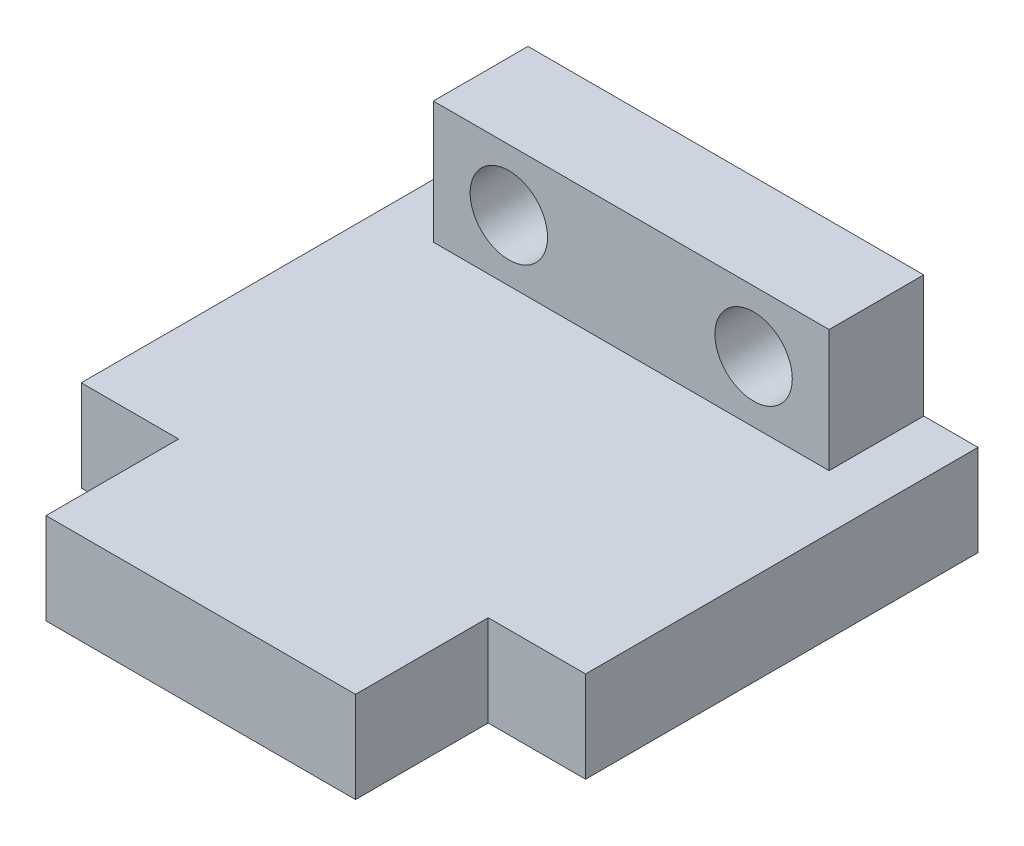
ISO-10303-21;
HEADER;
FILE_DESCRIPTION(('STEP AP214'),'2;1');
FILE_NAME('part.step','',(''),(''),'','','');
FILE_SCHEMA(('AUTOMOTIVE_DESIGN { 1 0 10303 214 1 1 1 1 }'));
ENDSEC;
DATA;
#1=APPLICATION_CONTEXT('core data for automotive mechanical design processes');
#2=APPLICATION_PROTOCOL_DEFINITION('international standard','automotive_design',2000,#1);
#3=PRODUCT_CONTEXT('',#1,'mechanical');
#4=PRODUCT('Part','Part','',(#3));
#5=PRODUCT_RELATED_PRODUCT_CATEGORY('part','',(#4));
#6=PRODUCT_DEFINITION_FORMATION('','',#4);
#7=PRODUCT_DEFINITION_CONTEXT('part definition',#1,'design');
#8=PRODUCT_DEFINITION('design','',#6,#7);
#9=PRODUCT_DEFINITION_SHAPE('','',#8);
#10=(LENGTH_UNIT() NAMED_UNIT(*) SI_UNIT(.MILLI.,.METRE.));
#11=(NAMED_UNIT(*) PLANE_ANGLE_UNIT() SI_UNIT($,.RADIAN.));
#12=(NAMED_UNIT(*) SI_UNIT($,.STERADIAN.) SOLID_ANGLE_UNIT());
#13=UNCERTAINTY_MEASURE_WITH_UNIT(LENGTH_MEASURE(1.E-05),#10,'distance_accuracy_value','');
#14=(GEOMETRIC_REPRESENTATION_CONTEXT(3) GLOBAL_UNCERTAINTY_ASSIGNED_CONTEXT((#13)) GLOBAL_UNIT_ASSIGNED_CONTEXT((#10,
#11,#12)) REPRESENTATION_CONTEXT('',''));
#15=CARTESIAN_POINT('',(0.,0.,0.));
#16=DIRECTION('',(0.,0.,1.));
#17=DIRECTION('',(1.,0.,0.));
#18=AXIS2_PLACEMENT_3D('',#15,#16,#17);
#19=CARTESIAN_POINT('',(0.,6.59,-4.595));
#20=DIRECTION('',(0.,0.,-1.));
#21=DIRECTION('',(-1.,0.,0.));
#22=AXIS2_PLACEMENT_3D('',#19,#20,#21);
#23=PLANE('',#22);
#24=CARTESIAN_POINT('',(-5.535,3.825,-4.595));
#25=DIRECTION('',(0.,0.,1.));
#26=DIRECTION('',(1.,0.,0.));
#27=AXIS2_PLACEMENT_3D('',#24,#25,#26);
#28=CIRCLE('',#27,1.75);
#29=CARTESIAN_POINT('',(-3.785,3.825,-4.595));
#30=VERTEX_POINT('',#29);
#31=EDGE_CURVE('E412',#30,#30,#28,.F.);
#32=ORIENTED_EDGE('',*,*,#31,.T.);
#33=EDGE_LOOP('',(#32));
#34=FACE_BOUND('',#33,.T.);
#35=CARTESIAN_POINT('',(5.535,3.825,-4.595));
#36=DIRECTION('',(0.,0.,1.));
#37=DIRECTION('',(1.,0.,0.));
#38=AXIS2_PLACEMENT_3D('',#35,#36,#37);
#39=CIRCLE('',#38,1.75);
#40=CARTESIAN_POINT('',(7.285,3.825,-4.595));
#41=VERTEX_POINT('',#40);
#42=EDGE_CURVE('E411',#41,#41,#39,.T.);
#43=ORIENTED_EDGE('',*,*,#42,.F.);
#44=EDGE_LOOP('',(#43));
#45=FACE_BOUND('',#44,.T.);
#46=DIRECTION('',(1.,0.,0.));
#47=VECTOR('',#46,1.);
#48=CARTESIAN_POINT('',(0.,6.59,-4.595));
#49=LINE('',#48,#47);
#50=CARTESIAN_POINT('',(-8.95,6.59,-4.595));
#51=VERTEX_POINT('',#50);
#52=CARTESIAN_POINT('',(8.95,6.59,-4.595));
#53=VERTEX_POINT('',#52);
#54=EDGE_CURVE('E427',#51,#53,#49,.T.);
#55=ORIENTED_EDGE('',*,*,#54,.F.);
#56=DIRECTION('',(0.,1.,0.));
#57=VECTOR('',#56,1.);
#58=CARTESIAN_POINT('',(-8.95,-3.8741083287662,-4.595));
#59=LINE('',#58,#57);
#60=CARTESIAN_POINT('',(-8.95,1.06,-4.595));
#61=VERTEX_POINT('',#60);
#62=EDGE_CURVE('E106',#61,#51,#59,.T.);
#63=ORIENTED_EDGE('',*,*,#62,.F.);
#64=DIRECTION('',(1.,0.,0.));
#65=VECTOR('',#64,1.);
#66=CARTESIAN_POINT('',(0.,1.06,-4.595));
#67=LINE('',#66,#65);
#68=CARTESIAN_POINT('',(8.95,1.06,-4.595));
#69=VERTEX_POINT('',#68);
#70=EDGE_CURVE('E259',#61,#69,#67,.T.);
#71=ORIENTED_EDGE('',*,*,#70,.T.);
#72=DIRECTION('',(0.,1.,0.));
#73=VECTOR('',#72,1.);
#74=CARTESIAN_POINT('',(8.95,-3.8741083287662,-4.595));
#75=LINE('',#74,#73);
#76=EDGE_CURVE('E275',#69,#53,#75,.T.);
#77=ORIENTED_EDGE('',*,*,#76,.T.);
#78=EDGE_LOOP('',(#55,#63,#71,#77));
#79=FACE_BOUND('',#78,.T.);
#80=ADVANCED_FACE('F82',(#34,#45,#79),#23,.F.);
#81=CARTESIAN_POINT('',(0.,6.59,0.));
#82=DIRECTION('',(0.,1.,0.));
#83=DIRECTION('',(0.,0.,1.));
#84=AXIS2_PLACEMENT_3D('',#81,#82,#83);
#85=PLANE('',#84);
#86=DIRECTION('',(0.,0.,-1.));
#87=VECTOR('',#86,1.);
#88=CARTESIAN_POINT('',(-8.95,6.59,0.));
#89=LINE('',#88,#87);
#90=CARTESIAN_POINT('',(-8.95,6.59,-8.875));
#91=VERTEX_POINT('',#90);
#92=EDGE_CURVE('E245',#51,#91,#89,.T.);
#93=ORIENTED_EDGE('',*,*,#92,.F.);
#94=ORIENTED_EDGE('',*,*,#54,.T.);
#95=DIRECTION('',(0.,0.,-1.));
#96=VECTOR('',#95,1.);
#97=CARTESIAN_POINT('',(8.95,6.59,0.));
#98=LINE('',#97,#96);
#99=CARTESIAN_POINT('',(8.95,6.59,-8.875));
#100=VERTEX_POINT('',#99);
#101=EDGE_CURVE('E272',#53,#100,#98,.T.);
#102=ORIENTED_EDGE('',*,*,#101,.T.);
#103=DIRECTION('',(-1.,0.,0.));
#104=VECTOR('',#103,1.);
#105=CARTESIAN_POINT('',(0.,6.59,-8.875));
#106=LINE('',#105,#104);
#107=EDGE_CURVE('E431',#100,#91,#106,.T.);
#108=ORIENTED_EDGE('',*,*,#107,.T.);
#109=EDGE_LOOP('',(#93,#94,#102,#108));
#110=FACE_BOUND('',#109,.T.);
#111=ADVANCED_FACE('F576',(#110),#85,.T.);
#112=CARTESIAN_POINT('',(0.,-3.0650367556628,-1.955));
#113=DIRECTION('',(0.,-1.,0.));
#114=DIRECTION('',(0.,0.,-1.));
#115=AXIS2_PLACEMENT_3D('',#112,#113,#114);
#116=PLANE('',#115);
#117=DIRECTION('',(1.,0.,0.));
#118=VECTOR('',#117,1.);
#119=CARTESIAN_POINT('',(0.,-3.0650367556628,6.675));
#120=LINE('',#119,#118);
#121=CARTESIAN_POINT('',(2.005,-3.0650367556628,6.675));
#122=VERTEX_POINT('',#121);
#123=CARTESIAN_POINT('',(7.855,-3.0650367556628,6.675));
#124=VERTEX_POINT('',#123);
#125=EDGE_CURVE('E319',#122,#124,#120,.T.);
#126=ORIENTED_EDGE('',*,*,#125,.T.);
#127=DIRECTION('',(0.,0.,-1.));
#128=VECTOR('',#127,1.);
#129=CARTESIAN_POINT('',(7.855,-3.0650367556628,0.));
#130=LINE('',#129,#128);
#131=CARTESIAN_POINT('',(7.855,-3.0650367556628,0.824999999999999));
#132=VERTEX_POINT('',#131);
#133=EDGE_CURVE('E296',#124,#132,#130,.T.);
#134=ORIENTED_EDGE('',*,*,#133,.T.);
#135=DIRECTION('',(1.,0.,0.));
#136=VECTOR('',#135,1.);
#137=CARTESIAN_POINT('',(0.,-3.0650367556628,0.824999999999999));
#138=LINE('',#137,#136);
#139=CARTESIAN_POINT('',(2.005,-3.0650367556628,0.824999999999999));
#140=VERTEX_POINT('',#139);
#141=EDGE_CURVE('E307',#140,#132,#138,.T.);
#142=ORIENTED_EDGE('',*,*,#141,.F.);
#143=DIRECTION('',(0.,0.,1.));
#144=VECTOR('',#143,1.);
#145=CARTESIAN_POINT('',(2.005,-3.0650367556628,0.));
#146=LINE('',#145,#144);
#147=EDGE_CURVE('E315',#140,#122,#146,.T.);
#148=ORIENTED_EDGE('',*,*,#147,.T.);
#149=EDGE_LOOP('',(#126,#134,#142,#148));
#150=FACE_BOUND('',#149,.T.);
#151=DIRECTION('',(-1.,0.,0.));
#152=VECTOR('',#151,1.);
#153=CARTESIAN_POINT('',(0.,-3.0650367556628,6.675));
#154=LINE('',#153,#152);
#155=CARTESIAN_POINT('',(-2.005,-3.0650367556628,6.675));
#156=VERTEX_POINT('',#155);
#157=CARTESIAN_POINT('',(-7.855,-3.0650367556628,6.675));
#158=VERTEX_POINT('',#157);
#159=EDGE_CURVE('E359',#156,#158,#154,.T.);
#160=ORIENTED_EDGE('',*,*,#159,.F.);
#161=DIRECTION('',(0.,0.,-1.));
#162=VECTOR('',#161,1.);
#163=CARTESIAN_POINT('',(-2.005,-3.0650367556628,0.));
#164=LINE('',#163,#162);
#165=CARTESIAN_POINT('',(-2.005,-3.0650367556628,0.824999999999998));
#166=VERTEX_POINT('',#165);
#167=EDGE_CURVE('E336',#156,#166,#164,.T.);
#168=ORIENTED_EDGE('',*,*,#167,.T.);
#169=DIRECTION('',(-1.,0.,0.));
#170=VECTOR('',#169,1.);
#171=CARTESIAN_POINT('',(0.,-3.0650367556628,0.824999999999998));
#172=LINE('',#171,#170);
#173=CARTESIAN_POINT('',(-7.855,-3.0650367556628,0.824999999999998));
#174=VERTEX_POINT('',#173);
#175=EDGE_CURVE('E348',#166,#174,#172,.T.);
#176=ORIENTED_EDGE('',*,*,#175,.T.);
#177=DIRECTION('',(0.,0.,-1.));
#178=VECTOR('',#177,1.);
#179=CARTESIAN_POINT('',(-7.855,-3.0650367556628,0.));
#180=LINE('',#179,#178);
#181=EDGE_CURVE('E363',#158,#174,#180,.T.);
#182=ORIENTED_EDGE('',*,*,#181,.F.);
#183=EDGE_LOOP('',(#160,#168,#176,#182));
#184=FACE_BOUND('',#183,.T.);
#185=DIRECTION('',(-1.,0.,0.));
#186=VECTOR('',#185,1.);
#187=CARTESIAN_POINT('',(0.,-3.0650367556628,-8.875));
#188=LINE('',#187,#186);
#189=CARTESIAN_POINT('',(11.405,-3.0650367556628,-8.875));
#190=VERTEX_POINT('',#189);
#191=CARTESIAN_POINT('',(9.965,-3.0650367556628,-8.875));
#192=VERTEX_POINT('',#191);
#193=EDGE_CURVE('E477',#190,#192,#188,.T.);
#194=ORIENTED_EDGE('',*,*,#193,.F.);
#195=DIRECTION('',(0.,0.,-1.));
#196=VECTOR('',#195,1.);
#197=CARTESIAN_POINT('',(11.405,-3.0650367556628,-1.955));
#198=LINE('',#197,#196);
#199=CARTESIAN_POINT('',(11.405,-3.0650367556628,8.875));
#200=VERTEX_POINT('',#199);
#201=EDGE_CURVE('E488',#200,#190,#198,.T.);
#202=ORIENTED_EDGE('',*,*,#201,.F.);
#203=DIRECTION('',(-1.,0.,0.));
#204=VECTOR('',#203,1.);
#205=CARTESIAN_POINT('',(0.,-3.0650367556628,8.875));
#206=LINE('',#205,#204);
#207=CARTESIAN_POINT('',(7.,-3.0650367556628,8.875));
#208=VERTEX_POINT('',#207);
#209=EDGE_CURVE('E441',#200,#208,#206,.T.);
#210=ORIENTED_EDGE('',*,*,#209,.T.);
#211=DIRECTION('',(0.,0.,-1.));
#212=VECTOR('',#211,1.);
#213=CARTESIAN_POINT('',(7.,-3.0650367556628,0.));
#214=LINE('',#213,#212);
#215=CARTESIAN_POINT('',(7.,-3.0650367556628,14.875));
#216=VERTEX_POINT('',#215);
#217=EDGE_CURVE('E385',#216,#208,#214,.T.);
#218=ORIENTED_EDGE('',*,*,#217,.F.);
#219=DIRECTION('',(1.,0.,0.));
#220=VECTOR('',#219,1.);
#221=CARTESIAN_POINT('',(0.,-3.0650367556628,14.875));
#222=LINE('',#221,#220);
#223=CARTESIAN_POINT('',(-7.,-3.0650367556628,14.875));
#224=VERTEX_POINT('',#223);
#225=EDGE_CURVE('E379',#224,#216,#222,.T.);
#226=ORIENTED_EDGE('',*,*,#225,.F.);
#227=DIRECTION('',(0.,0.,-1.));
#228=VECTOR('',#227,1.);
#229=CARTESIAN_POINT('',(-7.,-3.0650367556628,0.));
#230=LINE('',#229,#228);
#231=CARTESIAN_POINT('',(-7.,-3.0650367556628,8.875));
#232=VERTEX_POINT('',#231);
#233=EDGE_CURVE('E362',#224,#232,#230,.T.);
#234=ORIENTED_EDGE('',*,*,#233,.T.);
#235=CARTESIAN_POINT('',(-11.405,-3.0650367556628,8.875));
#236=VERTEX_POINT('',#235);
#237=EDGE_CURVE('E446',#232,#236,#206,.T.);
#238=ORIENTED_EDGE('',*,*,#237,.T.);
#239=DIRECTION('',(0.,0.,-1.));
#240=VECTOR('',#239,1.);
#241=CARTESIAN_POINT('',(-11.405,-3.0650367556628,-1.955));
#242=LINE('',#241,#240);
#243=CARTESIAN_POINT('',(-11.405,-3.0650367556628,-8.875));
#244=VERTEX_POINT('',#243);
#245=EDGE_CURVE('E461',#236,#244,#242,.T.);
#246=ORIENTED_EDGE('',*,*,#245,.T.);
#247=DIRECTION('',(1.,0.,0.));
#248=VECTOR('',#247,1.);
#249=CARTESIAN_POINT('',(0.,-3.0650367556628,-8.875));
#250=LINE('',#249,#248);
#251=CARTESIAN_POINT('',(-9.965,-3.0650367556628,-8.875));
#252=VERTEX_POINT('',#251);
#253=EDGE_CURVE('E454',#244,#252,#250,.T.);
#254=ORIENTED_EDGE('',*,*,#253,.T.);
#255=DIRECTION('',(0.,0.,-1.));
#256=VECTOR('',#255,1.);
#257=CARTESIAN_POINT('',(-9.965,-3.0650367556628,-1.955));
#258=LINE('',#257,#256);
#259=CARTESIAN_POINT('',(-9.965,-3.0650367556628,-1.955));
#260=VERTEX_POINT('',#259);
#261=EDGE_CURVE('E466',#260,#252,#258,.T.);
#262=ORIENTED_EDGE('',*,*,#261,.F.);
#263=DIRECTION('',(1.,0.,0.));
#264=VECTOR('',#263,1.);
#265=CARTESIAN_POINT('',(0.,-3.0650367556628,-1.955));
#266=LINE('',#265,#264);
#267=CARTESIAN_POINT('',(9.965,-3.0650367556628,-1.955));
#268=VERTEX_POINT('',#267);
#269=EDGE_CURVE('E440',#260,#268,#266,.T.);
#270=ORIENTED_EDGE('',*,*,#269,.T.);
#271=DIRECTION('',(0.,0.,-1.));
#272=VECTOR('',#271,1.);
#273=CARTESIAN_POINT('',(9.965,-3.0650367556628,-1.955));
#274=LINE('',#273,#272);
#275=EDGE_CURVE('E484',#268,#192,#274,.T.);
#276=ORIENTED_EDGE('',*,*,#275,.T.);
#277=EDGE_LOOP('',(#194,#202,#210,#218,#226,#234,#238,#246,#254,#262,#270,#276));
#278=FACE_BOUND('',#277,.T.);
#279=ADVANCED_FACE('F522',(#150,#184,#278),#116,.T.);
#280=CARTESIAN_POINT('',(-11.405,1.06,8.875));
#281=DIRECTION('',(0.,0.,-1.));
#282=DIRECTION('',(-1.,0.,0.));
#283=AXIS2_PLACEMENT_3D('',#280,#281,#282);
#284=PLANE('',#283);
#285=DIRECTION('',(0.,1.,0.));
#286=VECTOR('',#285,1.);
#287=CARTESIAN_POINT('',(7.,-18.2965829673906,8.875));
#288=LINE('',#287,#286);
#289=CARTESIAN_POINT('',(7.,1.06,8.875));
#290=VERTEX_POINT('',#289);
#291=EDGE_CURVE('E393',#208,#290,#288,.T.);
#292=ORIENTED_EDGE('',*,*,#291,.F.);
#293=ORIENTED_EDGE('',*,*,#209,.F.);
#294=DIRECTION('',(0.,-1.,0.));
#295=VECTOR('',#294,1.);
#296=CARTESIAN_POINT('',(11.405,1.06,8.875));
#297=LINE('',#296,#295);
#298=CARTESIAN_POINT('',(11.405,1.06,8.875));
#299=VERTEX_POINT('',#298);
#300=EDGE_CURVE('E506',#299,#200,#297,.T.);
#301=ORIENTED_EDGE('',*,*,#300,.F.);
#302=DIRECTION('',(1.,0.,0.));
#303=VECTOR('',#302,1.);
#304=CARTESIAN_POINT('',(-11.405,1.06,8.875));
#305=LINE('',#304,#303);
#306=EDGE_CURVE('E501',#290,#299,#305,.T.);
#307=ORIENTED_EDGE('',*,*,#306,.F.);
#308=EDGE_LOOP('',(#292,#293,#301,#307));
#309=FACE_BOUND('',#308,.T.);
#310=ADVANCED_FACE('F545',(#309),#284,.F.);
#311=CARTESIAN_POINT('',(-11.405,1.06,-8.875));
#312=DIRECTION('',(0.,0.,1.));
#313=DIRECTION('',(1.,0.,0.));
#314=AXIS2_PLACEMENT_3D('',#311,#312,#313);
#315=PLANE('',#314);
#316=CARTESIAN_POINT('',(5.535,3.825,-8.875));
#317=DIRECTION('',(0.,0.,1.));
#318=DIRECTION('',(1.,0.,0.));
#319=AXIS2_PLACEMENT_3D('',#316,#317,#318);
#320=CIRCLE('',#319,1.75);
#321=CARTESIAN_POINT('',(7.285,3.825,-8.875));
#322=VERTEX_POINT('',#321);
#323=EDGE_CURVE('E416',#322,#322,#320,.T.);
#324=ORIENTED_EDGE('',*,*,#323,.T.);
#325=EDGE_LOOP('',(#324));
#326=FACE_BOUND('',#325,.T.);
#327=DIRECTION('',(0.,-1.,0.));
#328=VECTOR('',#327,1.);
#329=CARTESIAN_POINT('',(-11.405,1.06,-8.875));
#330=LINE('',#329,#328);
#331=CARTESIAN_POINT('',(-11.405,1.06,-8.875));
#332=VERTEX_POINT('',#331);
#333=EDGE_CURVE('E91',#332,#244,#330,.T.);
#334=ORIENTED_EDGE('',*,*,#333,.F.);
#335=DIRECTION('',(-1.,0.,0.));
#336=VECTOR('',#335,1.);
#337=CARTESIAN_POINT('',(0.,1.06,-8.875));
#338=LINE('',#337,#336);
#339=CARTESIAN_POINT('',(-8.95,1.06,-8.875));
#340=VERTEX_POINT('',#339);
#341=EDGE_CURVE('E251',#340,#332,#338,.T.);
#342=ORIENTED_EDGE('',*,*,#341,.F.);
#343=DIRECTION('',(0.,1.,0.));
#344=VECTOR('',#343,1.);
#345=CARTESIAN_POINT('',(-8.95,-3.8741083287662,-8.875));
#346=LINE('',#345,#344);
#347=EDGE_CURVE('E241',#340,#91,#346,.T.);
#348=ORIENTED_EDGE('',*,*,#347,.T.);
#349=ORIENTED_EDGE('',*,*,#107,.F.);
#350=DIRECTION('',(0.,1.,0.));
#351=VECTOR('',#350,1.);
#352=CARTESIAN_POINT('',(8.95,-3.8741083287662,-8.875));
#353=LINE('',#352,#351);
#354=CARTESIAN_POINT('',(8.95,1.06,-8.875));
#355=VERTEX_POINT('',#354);
#356=EDGE_CURVE('E98',#355,#100,#353,.T.);
#357=ORIENTED_EDGE('',*,*,#356,.F.);
#358=DIRECTION('',(-1.,0.,0.));
#359=VECTOR('',#358,1.);
#360=CARTESIAN_POINT('',(0.,1.06,-8.875));
#361=LINE('',#360,#359);
#362=CARTESIAN_POINT('',(11.405,1.06,-8.875));
#363=VERTEX_POINT('',#362);
#364=EDGE_CURVE('E279',#363,#355,#361,.T.);
#365=ORIENTED_EDGE('',*,*,#364,.F.);
#366=DIRECTION('',(0.,-1.,0.));
#367=VECTOR('',#366,1.);
#368=CARTESIAN_POINT('',(11.405,1.06,-8.875));
#369=LINE('',#368,#367);
#370=EDGE_CURVE('E12',#363,#190,#369,.T.);
#371=ORIENTED_EDGE('',*,*,#370,.T.);
#372=ORIENTED_EDGE('',*,*,#193,.T.);
#373=DIRECTION('',(0.,-1.,0.));
#374=VECTOR('',#373,1.);
#375=CARTESIAN_POINT('',(9.965,0.,-8.875));
#376=LINE('',#375,#374);
#377=CARTESIAN_POINT('',(9.965,0.,-8.875));
#378=VERTEX_POINT('',#377);
#379=EDGE_CURVE('E465',#378,#192,#376,.T.);
#380=ORIENTED_EDGE('',*,*,#379,.F.);
#381=DIRECTION('',(-1.,0.,0.));
#382=VECTOR('',#381,1.);
#383=CARTESIAN_POINT('',(-11.405,0.,-8.875));
#384=LINE('',#383,#382);
#385=CARTESIAN_POINT('',(-9.965,0.,-8.875));
#386=VERTEX_POINT('',#385);
#387=EDGE_CURVE('E487',#378,#386,#384,.T.);
#388=ORIENTED_EDGE('',*,*,#387,.T.);
#389=DIRECTION('',(0.,-1.,0.));
#390=VECTOR('',#389,1.);
#391=CARTESIAN_POINT('',(-9.965,0.,-8.875));
#392=LINE('',#391,#390);
#393=EDGE_CURVE('E445',#386,#252,#392,.T.);
#394=ORIENTED_EDGE('',*,*,#393,.T.);
#395=ORIENTED_EDGE('',*,*,#253,.F.);
#396=EDGE_LOOP('',(#334,#342,#348,#349,#357,#365,#371,#372,#380,#388,#394,#395));
#397=FACE_BOUND('',#396,.T.);
#398=CARTESIAN_POINT('',(-5.535,3.825,-8.875));
#399=DIRECTION('',(0.,0.,1.));
#400=DIRECTION('',(1.,0.,0.));
#401=AXIS2_PLACEMENT_3D('',#398,#399,#400);
#402=CIRCLE('',#401,1.75);
#403=CARTESIAN_POINT('',(-3.785,3.825,-8.875));
#404=VERTEX_POINT('',#403);
#405=EDGE_CURVE('E423',#404,#404,#402,.F.);
#406=ORIENTED_EDGE('',*,*,#405,.F.);
#407=EDGE_LOOP('',(#406));
#408=FACE_BOUND('',#407,.T.);
#409=ADVANCED_FACE('F262',(#326,#397,#408),#315,.F.);
#410=CARTESIAN_POINT('',(0.,1.06,0.));
#411=DIRECTION('',(0.,-1.,0.));
#412=DIRECTION('',(0.,0.,-1.));
#413=AXIS2_PLACEMENT_3D('',#410,#411,#412);
#414=PLANE('',#413);
#415=ORIENTED_EDGE('',*,*,#70,.F.);
#416=DIRECTION('',(0.,0.,-1.));
#417=VECTOR('',#416,1.);
#418=CARTESIAN_POINT('',(-8.95,1.06,0.));
#419=LINE('',#418,#417);
#420=EDGE_CURVE('E244',#61,#340,#419,.T.);
#421=ORIENTED_EDGE('',*,*,#420,.T.);
#422=ORIENTED_EDGE('',*,*,#341,.T.);
#423=DIRECTION('',(0.,0.,1.));
#424=VECTOR('',#423,1.);
#425=CARTESIAN_POINT('',(-11.405,1.06,8.875));
#426=LINE('',#425,#424);
#427=CARTESIAN_POINT('',(-11.405,1.06,8.875));
#428=VERTEX_POINT('',#427);
#429=EDGE_CURVE('E498',#332,#428,#426,.T.);
#430=ORIENTED_EDGE('',*,*,#429,.T.);
#431=CARTESIAN_POINT('',(-7.,1.06,8.875));
#432=VERTEX_POINT('',#431);
#433=EDGE_CURVE('E502',#428,#432,#305,.T.);
#434=ORIENTED_EDGE('',*,*,#433,.T.);
#435=DIRECTION('',(0.,0.,-1.));
#436=VECTOR('',#435,1.);
#437=CARTESIAN_POINT('',(-7.,1.06,0.));
#438=LINE('',#437,#436);
#439=CARTESIAN_POINT('',(-7.,1.06,14.875));
#440=VERTEX_POINT('',#439);
#441=EDGE_CURVE('E375',#440,#432,#438,.T.);
#442=ORIENTED_EDGE('',*,*,#441,.F.);
#443=DIRECTION('',(1.,0.,0.));
#444=VECTOR('',#443,1.);
#445=CARTESIAN_POINT('',(0.,1.06,14.875));
#446=LINE('',#445,#444);
#447=CARTESIAN_POINT('',(7.,1.06,14.875));
#448=VERTEX_POINT('',#447);
#449=EDGE_CURVE('E386',#440,#448,#446,.T.);
#450=ORIENTED_EDGE('',*,*,#449,.T.);
#451=DIRECTION('',(0.,0.,-1.));
#452=VECTOR('',#451,1.);
#453=CARTESIAN_POINT('',(7.,1.06,0.));
#454=LINE('',#453,#452);
#455=EDGE_CURVE('E381',#448,#290,#454,.T.);
#456=ORIENTED_EDGE('',*,*,#455,.T.);
#457=ORIENTED_EDGE('',*,*,#306,.T.);
#458=DIRECTION('',(0.,0.,-1.));
#459=VECTOR('',#458,1.);
#460=CARTESIAN_POINT('',(11.405,1.06,8.875));
#461=LINE('',#460,#459);
#462=EDGE_CURVE('E495',#299,#363,#461,.T.);
#463=ORIENTED_EDGE('',*,*,#462,.T.);
#464=ORIENTED_EDGE('',*,*,#364,.T.);
#465=DIRECTION('',(0.,0.,-1.));
#466=VECTOR('',#465,1.);
#467=CARTESIAN_POINT('',(8.95,1.06,0.));
#468=LINE('',#467,#466);
#469=EDGE_CURVE('E276',#69,#355,#468,.T.);
#470=ORIENTED_EDGE('',*,*,#469,.F.);
#471=EDGE_LOOP('',(#415,#421,#422,#430,#434,#442,#450,#456,#457,#463,#464,#470));
#472=FACE_BOUND('',#471,.T.);
#473=ADVANCED_FACE('F256',(#472),#414,.F.);
#474=CARTESIAN_POINT('',(0.,0.,0.));
#475=DIRECTION('',(0.,-1.,0.));
#476=DIRECTION('',(0.,0.,-1.));
#477=AXIS2_PLACEMENT_3D('',#474,#475,#476);
#478=PLANE('',#477);
#479=DIRECTION('',(0.,0.,-1.));
#480=VECTOR('',#479,1.);
#481=CARTESIAN_POINT('',(9.965,0.,-1.955));
#482=LINE('',#481,#480);
#483=CARTESIAN_POINT('',(9.965,0.,-1.955));
#484=VERTEX_POINT('',#483);
#485=EDGE_CURVE('E476',#484,#378,#482,.T.);
#486=ORIENTED_EDGE('',*,*,#485,.F.);
#487=DIRECTION('',(1.,0.,0.));
#488=VECTOR('',#487,1.);
#489=CARTESIAN_POINT('',(0.,0.,-1.955));
#490=LINE('',#489,#488);
#491=CARTESIAN_POINT('',(-9.965,0.,-1.955));
#492=VERTEX_POINT('',#491);
#493=EDGE_CURVE('E434',#492,#484,#490,.T.);
#494=ORIENTED_EDGE('',*,*,#493,.F.);
#495=DIRECTION('',(0.,0.,-1.));
#496=VECTOR('',#495,1.);
#497=CARTESIAN_POINT('',(-9.965,0.,-1.955));
#498=LINE('',#497,#496);
#499=EDGE_CURVE('E453',#492,#386,#498,.T.);
#500=ORIENTED_EDGE('',*,*,#499,.T.);
#501=ORIENTED_EDGE('',*,*,#387,.F.);
#502=EDGE_LOOP('',(#486,#494,#500,#501));
#503=FACE_BOUND('',#502,.T.);
#504=ADVANCED_FACE('F530',(#503),#478,.T.);
#505=CARTESIAN_POINT('',(11.405,1.06,8.875));
#506=DIRECTION('',(-1.,0.,0.));
#507=DIRECTION('',(0.,0.,1.));
#508=AXIS2_PLACEMENT_3D('',#505,#506,#507);
#509=PLANE('',#508);
#510=ORIENTED_EDGE('',*,*,#370,.F.);
#511=ORIENTED_EDGE('',*,*,#462,.F.);
#512=ORIENTED_EDGE('',*,*,#300,.T.);
#513=ORIENTED_EDGE('',*,*,#201,.T.);
#514=EDGE_LOOP('',(#510,#511,#512,#513));
#515=FACE_BOUND('',#514,.T.);
#516=ADVANCED_FACE('F84',(#515),#509,.F.);
#517=CARTESIAN_POINT('',(-11.405,1.06,8.875));
#518=DIRECTION('',(1.,0.,0.));
#519=DIRECTION('',(0.,0.,-1.));
#520=AXIS2_PLACEMENT_3D('',#517,#518,#519);
#521=PLANE('',#520);
#522=ORIENTED_EDGE('',*,*,#429,.F.);
#523=ORIENTED_EDGE('',*,*,#333,.T.);
#524=ORIENTED_EDGE('',*,*,#245,.F.);
#525=DIRECTION('',(0.,-1.,0.));
#526=VECTOR('',#525,1.);
#527=CARTESIAN_POINT('',(-11.405,1.06,8.875));
#528=LINE('',#527,#526);
#529=EDGE_CURVE('E512',#428,#236,#528,.T.);
#530=ORIENTED_EDGE('',*,*,#529,.F.);
#531=EDGE_LOOP('',(#522,#523,#524,#530));
#532=FACE_BOUND('',#531,.T.);
#533=ADVANCED_FACE('F518',(#532),#521,.F.);
#534=ORIENTED_EDGE('',*,*,#237,.F.);
#535=DIRECTION('',(0.,1.,0.));
#536=VECTOR('',#535,1.);
#537=CARTESIAN_POINT('',(-7.,-18.2965829673906,8.875));
#538=LINE('',#537,#536);
#539=EDGE_CURVE('E403',#232,#432,#538,.T.);
#540=ORIENTED_EDGE('',*,*,#539,.T.);
#541=ORIENTED_EDGE('',*,*,#433,.F.);
#542=ORIENTED_EDGE('',*,*,#529,.T.);
#543=EDGE_LOOP('',(#534,#540,#541,#542));
#544=FACE_BOUND('',#543,.T.);
#545=ADVANCED_FACE('F561',(#544),#284,.F.);
#546=CARTESIAN_POINT('',(9.965,0.,-1.955));
#547=DIRECTION('',(1.,0.,0.));
#548=DIRECTION('',(0.,0.,-1.));
#549=AXIS2_PLACEMENT_3D('',#546,#547,#548);
#550=PLANE('',#549);
#551=ORIENTED_EDGE('',*,*,#379,.T.);
#552=ORIENTED_EDGE('',*,*,#275,.F.);
#553=DIRECTION('',(0.,-1.,0.));
#554=VECTOR('',#553,1.);
#555=CARTESIAN_POINT('',(9.965,0.,-1.955));
#556=LINE('',#555,#554);
#557=EDGE_CURVE('E472',#484,#268,#556,.T.);
#558=ORIENTED_EDGE('',*,*,#557,.F.);
#559=ORIENTED_EDGE('',*,*,#485,.T.);
#560=EDGE_LOOP('',(#551,#552,#558,#559));
#561=FACE_BOUND('',#560,.T.);
#562=ADVANCED_FACE('F537',(#561),#550,.F.);
#563=CARTESIAN_POINT('',(-9.965,0.,-1.955));
#564=DIRECTION('',(1.,0.,0.));
#565=DIRECTION('',(0.,0.,-1.));
#566=AXIS2_PLACEMENT_3D('',#563,#564,#565);
#567=PLANE('',#566);
#568=ORIENTED_EDGE('',*,*,#393,.F.);
#569=ORIENTED_EDGE('',*,*,#499,.F.);
#570=DIRECTION('',(0.,-1.,0.));
#571=VECTOR('',#570,1.);
#572=CARTESIAN_POINT('',(-9.965,0.,-1.955));
#573=LINE('',#572,#571);
#574=EDGE_CURVE('E450',#492,#260,#573,.T.);
#575=ORIENTED_EDGE('',*,*,#574,.T.);
#576=ORIENTED_EDGE('',*,*,#261,.T.);
#577=EDGE_LOOP('',(#568,#569,#575,#576));
#578=FACE_BOUND('',#577,.T.);
#579=ADVANCED_FACE('F527',(#578),#567,.T.);
#580=CARTESIAN_POINT('',(0.,-28.3154822962864,-1.955));
#581=DIRECTION('',(0.,0.,1.));
#582=DIRECTION('',(1.,0.,0.));
#583=AXIS2_PLACEMENT_3D('',#580,#581,#582);
#584=PLANE('',#583);
#585=ORIENTED_EDGE('',*,*,#493,.T.);
#586=ORIENTED_EDGE('',*,*,#557,.T.);
#587=ORIENTED_EDGE('',*,*,#269,.F.);
#588=ORIENTED_EDGE('',*,*,#574,.F.);
#589=EDGE_LOOP('',(#585,#586,#587,#588));
#590=FACE_BOUND('',#589,.T.);
#591=ADVANCED_FACE('F533',(#590),#584,.F.);
#592=CARTESIAN_POINT('',(5.535,3.825,-10.125));
#593=DIRECTION('',(0.,0.,1.));
#594=DIRECTION('',(1.,0.,0.));
#595=AXIS2_PLACEMENT_3D('',#592,#593,#594);
#596=CYLINDRICAL_SURFACE('',#595,1.75);
#597=ORIENTED_EDGE('',*,*,#42,.T.);
#598=EDGE_LOOP('',(#597));
#599=FACE_BOUND('',#598,.T.);
#600=ORIENTED_EDGE('',*,*,#323,.F.);
#601=EDGE_LOOP('',(#600));
#602=FACE_BOUND('',#601,.T.);
#603=ADVANCED_FACE('F590',(#599,#602),#596,.F.);
#604=CARTESIAN_POINT('',(-5.535,3.825,-10.125));
#605=DIRECTION('',(0.,0.,1.));
#606=DIRECTION('',(1.,0.,0.));
#607=AXIS2_PLACEMENT_3D('',#604,#605,#606);
#608=CYLINDRICAL_SURFACE('',#607,1.75);
#609=ORIENTED_EDGE('',*,*,#31,.F.);
#610=EDGE_LOOP('',(#609));
#611=FACE_BOUND('',#610,.T.);
#612=ORIENTED_EDGE('',*,*,#405,.T.);
#613=EDGE_LOOP('',(#612));
#614=FACE_BOUND('',#613,.T.);
#615=ADVANCED_FACE('F779',(#611,#614),#608,.F.);
#616=CARTESIAN_POINT('',(7.,-18.2965829673906,0.));
#617=DIRECTION('',(1.,0.,0.));
#618=DIRECTION('',(0.,0.,-1.));
#619=AXIS2_PLACEMENT_3D('',#616,#617,#618);
#620=PLANE('',#619);
#621=DIRECTION('',(0.,1.,0.));
#622=VECTOR('',#621,1.);
#623=CARTESIAN_POINT('',(7.,-18.2965829673906,14.875));
#624=LINE('',#623,#622);
#625=EDGE_CURVE('E397',#216,#448,#624,.T.);
#626=ORIENTED_EDGE('',*,*,#625,.F.);
#627=ORIENTED_EDGE('',*,*,#217,.T.);
#628=ORIENTED_EDGE('',*,*,#291,.T.);
#629=ORIENTED_EDGE('',*,*,#455,.F.);
#630=EDGE_LOOP('',(#626,#627,#628,#629));
#631=FACE_BOUND('',#630,.T.);
#632=ADVANCED_FACE('F549',(#631),#620,.T.);
#633=CARTESIAN_POINT('',(-7.,-18.2965829673906,0.));
#634=DIRECTION('',(1.,0.,0.));
#635=DIRECTION('',(0.,0.,-1.));
#636=AXIS2_PLACEMENT_3D('',#633,#634,#635);
#637=PLANE('',#636);
#638=ORIENTED_EDGE('',*,*,#233,.F.);
#639=DIRECTION('',(0.,1.,0.));
#640=VECTOR('',#639,1.);
#641=CARTESIAN_POINT('',(-7.,-18.2965829673906,14.875));
#642=LINE('',#641,#640);
#643=EDGE_CURVE('E380',#224,#440,#642,.T.);
#644=ORIENTED_EDGE('',*,*,#643,.T.);
#645=ORIENTED_EDGE('',*,*,#441,.T.);
#646=ORIENTED_EDGE('',*,*,#539,.F.);
#647=EDGE_LOOP('',(#638,#644,#645,#646));
#648=FACE_BOUND('',#647,.T.);
#649=ADVANCED_FACE('F558',(#648),#637,.F.);
#650=CARTESIAN_POINT('',(0.,-18.2965829673906,14.875));
#651=DIRECTION('',(0.,0.,1.));
#652=DIRECTION('',(1.,0.,0.));
#653=AXIS2_PLACEMENT_3D('',#650,#651,#652);
#654=PLANE('',#653);
#655=ORIENTED_EDGE('',*,*,#643,.F.);
#656=ORIENTED_EDGE('',*,*,#225,.T.);
#657=ORIENTED_EDGE('',*,*,#625,.T.);
#658=ORIENTED_EDGE('',*,*,#449,.F.);
#659=EDGE_LOOP('',(#655,#656,#657,#658));
#660=FACE_BOUND('',#659,.T.);
#661=ADVANCED_FACE('F554',(#660),#654,.T.);
#662=CARTESIAN_POINT('',(-4.93,-4.9150367556628,3.75));
#663=DIRECTION('',(0.,-1.,0.));
#664=DIRECTION('',(0.,0.,-1.));
#665=AXIS2_PLACEMENT_3D('',#662,#663,#664);
#666=PLANE('',#665);
#667=DIRECTION('',(0.,0.,1.));
#668=VECTOR('',#667,1.);
#669=CARTESIAN_POINT('',(-7.855,-4.9150367556628,0.));
#670=LINE('',#669,#668);
#671=CARTESIAN_POINT('',(-7.855,-4.9150367556628,0.824999999999998));
#672=VERTEX_POINT('',#671);
#673=CARTESIAN_POINT('',(-7.855,-4.9150367556628,6.675));
#674=VERTEX_POINT('',#673);
#675=EDGE_CURVE('E366',#672,#674,#670,.T.);
#676=ORIENTED_EDGE('',*,*,#675,.F.);
#677=DIRECTION('',(1.,0.,0.));
#678=VECTOR('',#677,1.);
#679=CARTESIAN_POINT('',(0.,-4.9150367556628,0.824999999999998));
#680=LINE('',#679,#678);
#681=CARTESIAN_POINT('',(-2.005,-4.9150367556628,0.824999999999998));
#682=VERTEX_POINT('',#681);
#683=EDGE_CURVE('E353',#672,#682,#680,.T.);
#684=ORIENTED_EDGE('',*,*,#683,.T.);
#685=DIRECTION('',(0.,0.,1.));
#686=VECTOR('',#685,1.);
#687=CARTESIAN_POINT('',(-2.005,-4.9150367556628,0.));
#688=LINE('',#687,#686);
#689=CARTESIAN_POINT('',(-2.005,-4.9150367556628,6.675));
#690=VERTEX_POINT('',#689);
#691=EDGE_CURVE('E341',#682,#690,#688,.T.);
#692=ORIENTED_EDGE('',*,*,#691,.T.);
#693=DIRECTION('',(1.,0.,0.));
#694=VECTOR('',#693,1.);
#695=CARTESIAN_POINT('',(0.,-4.9150367556628,6.675));
#696=LINE('',#695,#694);
#697=EDGE_CURVE('E352',#674,#690,#696,.T.);
#698=ORIENTED_EDGE('',*,*,#697,.F.);
#699=EDGE_LOOP('',(#676,#684,#692,#698));
#700=FACE_BOUND('',#699,.T.);
#701=ADVANCED_FACE('F744',(#700),#666,.T.);
#702=CARTESIAN_POINT('',(4.93,-4.9150367556628,3.75));
#703=DIRECTION('',(0.,-1.,0.));
#704=DIRECTION('',(0.,0.,-1.));
#705=AXIS2_PLACEMENT_3D('',#702,#703,#704);
#706=PLANE('',#705);
#707=DIRECTION('',(0.,0.,-1.));
#708=VECTOR('',#707,1.);
#709=CARTESIAN_POINT('',(2.005,-4.9150367556628,0.));
#710=LINE('',#709,#708);
#711=CARTESIAN_POINT('',(2.005,-4.9150367556628,6.675));
#712=VERTEX_POINT('',#711);
#713=CARTESIAN_POINT('',(2.005,-4.9150367556628,0.824999999999999));
#714=VERTEX_POINT('',#713);
#715=EDGE_CURVE('E324',#712,#714,#710,.T.);
#716=ORIENTED_EDGE('',*,*,#715,.T.);
#717=DIRECTION('',(-1.,0.,0.));
#718=VECTOR('',#717,1.);
#719=CARTESIAN_POINT('',(0.,-4.9150367556628,0.824999999999999));
#720=LINE('',#719,#718);
#721=CARTESIAN_POINT('',(7.855,-4.9150367556628,0.824999999999999));
#722=VERTEX_POINT('',#721);
#723=EDGE_CURVE('E308',#722,#714,#720,.T.);
#724=ORIENTED_EDGE('',*,*,#723,.F.);
#725=DIRECTION('',(0.,0.,1.));
#726=VECTOR('',#725,1.);
#727=CARTESIAN_POINT('',(7.855,-4.9150367556628,0.));
#728=LINE('',#727,#726);
#729=CARTESIAN_POINT('',(7.855,-4.9150367556628,6.675));
#730=VERTEX_POINT('',#729);
#731=EDGE_CURVE('E291',#722,#730,#728,.T.);
#732=ORIENTED_EDGE('',*,*,#731,.T.);
#733=DIRECTION('',(-1.,0.,0.));
#734=VECTOR('',#733,1.);
#735=CARTESIAN_POINT('',(0.,-4.9150367556628,6.675));
#736=LINE('',#735,#734);
#737=EDGE_CURVE('E312',#730,#712,#736,.T.);
#738=ORIENTED_EDGE('',*,*,#737,.T.);
#739=EDGE_LOOP('',(#716,#724,#732,#738));
#740=FACE_BOUND('',#739,.T.);
#741=ADVANCED_FACE('F728',(#740),#706,.T.);
#742=CARTESIAN_POINT('',(-7.855,1.0715379142785,0.));
#743=DIRECTION('',(1.,0.,0.));
#744=DIRECTION('',(0.,0.,-1.));
#745=AXIS2_PLACEMENT_3D('',#742,#743,#744);
#746=PLANE('',#745);
#747=DIRECTION('',(0.,-1.,0.));
#748=VECTOR('',#747,1.);
#749=CARTESIAN_POINT('',(-7.855,1.0715379142785,6.675));
#750=LINE('',#749,#748);
#751=EDGE_CURVE('E370',#158,#674,#750,.T.);
#752=ORIENTED_EDGE('',*,*,#751,.F.);
#753=ORIENTED_EDGE('',*,*,#181,.T.);
#754=DIRECTION('',(0.,-1.,0.));
#755=VECTOR('',#754,1.);
#756=CARTESIAN_POINT('',(-7.855,1.0715379142785,0.824999999999998));
#757=LINE('',#756,#755);
#758=EDGE_CURVE('E340',#174,#672,#757,.T.);
#759=ORIENTED_EDGE('',*,*,#758,.T.);
#760=ORIENTED_EDGE('',*,*,#675,.T.);
#761=EDGE_LOOP('',(#752,#753,#759,#760));
#762=FACE_BOUND('',#761,.T.);
#763=ADVANCED_FACE('F717',(#762),#746,.F.);
#764=CARTESIAN_POINT('',(0.,1.0715379142785,6.675));
#765=DIRECTION('',(0.,0.,-1.));
#766=DIRECTION('',(-1.,0.,0.));
#767=AXIS2_PLACEMENT_3D('',#764,#765,#766);
#768=PLANE('',#767);
#769=ORIENTED_EDGE('',*,*,#697,.T.);
#770=DIRECTION('',(0.,-1.,0.));
#771=VECTOR('',#770,1.);
#772=CARTESIAN_POINT('',(-2.005,1.0715379142785,6.675));
#773=LINE('',#772,#771);
#774=EDGE_CURVE('E331',#156,#690,#773,.T.);
#775=ORIENTED_EDGE('',*,*,#774,.F.);
#776=ORIENTED_EDGE('',*,*,#159,.T.);
#777=ORIENTED_EDGE('',*,*,#751,.T.);
#778=EDGE_LOOP('',(#769,#775,#776,#777));
#779=FACE_BOUND('',#778,.T.);
#780=ADVANCED_FACE('F707',(#779),#768,.F.);
#781=CARTESIAN_POINT('',(0.,1.0715379142785,0.824999999999998));
#782=DIRECTION('',(0.,0.,-1.));
#783=DIRECTION('',(-1.,0.,0.));
#784=AXIS2_PLACEMENT_3D('',#781,#782,#783);
#785=PLANE('',#784);
#786=ORIENTED_EDGE('',*,*,#175,.F.);
#787=DIRECTION('',(0.,-1.,0.));
#788=VECTOR('',#787,1.);
#789=CARTESIAN_POINT('',(-2.005,1.0715379142785,0.824999999999998));
#790=LINE('',#789,#788);
#791=EDGE_CURVE('E335',#166,#682,#790,.T.);
#792=ORIENTED_EDGE('',*,*,#791,.T.);
#793=ORIENTED_EDGE('',*,*,#683,.F.);
#794=ORIENTED_EDGE('',*,*,#758,.F.);
#795=EDGE_LOOP('',(#786,#792,#793,#794));
#796=FACE_BOUND('',#795,.T.);
#797=ADVANCED_FACE('F696',(#796),#785,.T.);
#798=CARTESIAN_POINT('',(-2.005,1.0715379142785,0.));
#799=DIRECTION('',(1.,0.,0.));
#800=DIRECTION('',(0.,0.,-1.));
#801=AXIS2_PLACEMENT_3D('',#798,#799,#800);
#802=PLANE('',#801);
#803=ORIENTED_EDGE('',*,*,#167,.F.);
#804=ORIENTED_EDGE('',*,*,#774,.T.);
#805=ORIENTED_EDGE('',*,*,#691,.F.);
#806=ORIENTED_EDGE('',*,*,#791,.F.);
#807=EDGE_LOOP('',(#803,#804,#805,#806));
#808=FACE_BOUND('',#807,.T.);
#809=ADVANCED_FACE('F685',(#808),#802,.T.);
#810=CARTESIAN_POINT('',(2.005,1.0715379142785,0.));
#811=DIRECTION('',(-1.,0.,0.));
#812=DIRECTION('',(0.,0.,1.));
#813=AXIS2_PLACEMENT_3D('',#810,#811,#812);
#814=PLANE('',#813);
#815=ORIENTED_EDGE('',*,*,#147,.F.);
#816=DIRECTION('',(0.,-1.,0.));
#817=VECTOR('',#816,1.);
#818=CARTESIAN_POINT('',(2.005,1.0715379142785,0.824999999999999));
#819=LINE('',#818,#817);
#820=EDGE_CURVE('E303',#140,#714,#819,.T.);
#821=ORIENTED_EDGE('',*,*,#820,.T.);
#822=ORIENTED_EDGE('',*,*,#715,.F.);
#823=DIRECTION('',(0.,-1.,0.));
#824=VECTOR('',#823,1.);
#825=CARTESIAN_POINT('',(2.005,1.0715379142785,6.675));
#826=LINE('',#825,#824);
#827=EDGE_CURVE('E320',#122,#712,#826,.T.);
#828=ORIENTED_EDGE('',*,*,#827,.F.);
#829=EDGE_LOOP('',(#815,#821,#822,#828));
#830=FACE_BOUND('',#829,.T.);
#831=ADVANCED_FACE('F674',(#830),#814,.T.);
#832=CARTESIAN_POINT('',(0.,1.0715379142785,6.675));
#833=DIRECTION('',(0.,0.,1.));
#834=DIRECTION('',(1.,0.,0.));
#835=AXIS2_PLACEMENT_3D('',#832,#833,#834);
#836=PLANE('',#835);
#837=ORIENTED_EDGE('',*,*,#125,.F.);
#838=ORIENTED_EDGE('',*,*,#827,.T.);
#839=ORIENTED_EDGE('',*,*,#737,.F.);
#840=DIRECTION('',(0.,-1.,0.));
#841=VECTOR('',#840,1.);
#842=CARTESIAN_POINT('',(7.855,1.0715379142785,6.675));
#843=LINE('',#842,#841);
#844=EDGE_CURVE('E268',#124,#730,#843,.T.);
#845=ORIENTED_EDGE('',*,*,#844,.F.);
#846=EDGE_LOOP('',(#837,#838,#839,#845));
#847=FACE_BOUND('',#846,.T.);
#848=ADVANCED_FACE('F664',(#847),#836,.T.);
#849=CARTESIAN_POINT('',(0.,1.0715379142785,0.824999999999999));
#850=DIRECTION('',(0.,0.,1.));
#851=DIRECTION('',(1.,0.,0.));
#852=AXIS2_PLACEMENT_3D('',#849,#850,#851);
#853=PLANE('',#852);
#854=ORIENTED_EDGE('',*,*,#820,.F.);
#855=ORIENTED_EDGE('',*,*,#141,.T.);
#856=DIRECTION('',(0.,-1.,0.));
#857=VECTOR('',#856,1.);
#858=CARTESIAN_POINT('',(7.855,1.0715379142785,0.824999999999999));
#859=LINE('',#858,#857);
#860=EDGE_CURVE('E292',#132,#722,#859,.T.);
#861=ORIENTED_EDGE('',*,*,#860,.T.);
#862=ORIENTED_EDGE('',*,*,#723,.T.);
#863=EDGE_LOOP('',(#854,#855,#861,#862));
#864=FACE_BOUND('',#863,.T.);
#865=ADVANCED_FACE('F654',(#864),#853,.F.);
#866=CARTESIAN_POINT('',(7.855,1.0715379142785,0.));
#867=DIRECTION('',(1.,0.,0.));
#868=DIRECTION('',(0.,0.,-1.));
#869=AXIS2_PLACEMENT_3D('',#866,#867,#868);
#870=PLANE('',#869);
#871=ORIENTED_EDGE('',*,*,#133,.F.);
#872=ORIENTED_EDGE('',*,*,#844,.T.);
#873=ORIENTED_EDGE('',*,*,#731,.F.);
#874=ORIENTED_EDGE('',*,*,#860,.F.);
#875=EDGE_LOOP('',(#871,#872,#873,#874));
#876=FACE_BOUND('',#875,.T.);
#877=ADVANCED_FACE('F619',(#876),#870,.T.);
#878=CARTESIAN_POINT('',(8.95,-3.8741083287662,0.));
#879=DIRECTION('',(1.,0.,0.));
#880=DIRECTION('',(0.,0.,-1.));
#881=AXIS2_PLACEMENT_3D('',#878,#879,#880);
#882=PLANE('',#881);
#883=ORIENTED_EDGE('',*,*,#469,.T.);
#884=ORIENTED_EDGE('',*,*,#356,.T.);
#885=ORIENTED_EDGE('',*,*,#101,.F.);
#886=ORIENTED_EDGE('',*,*,#76,.F.);
#887=EDGE_LOOP('',(#883,#884,#885,#886));
#888=FACE_BOUND('',#887,.T.);
#889=ADVANCED_FACE('F614',(#888),#882,.T.);
#890=CARTESIAN_POINT('',(-8.95,-3.8741083287662,0.));
#891=DIRECTION('',(1.,0.,0.));
#892=DIRECTION('',(0.,0.,-1.));
#893=AXIS2_PLACEMENT_3D('',#890,#891,#892);
#894=PLANE('',#893);
#895=ORIENTED_EDGE('',*,*,#62,.T.);
#896=ORIENTED_EDGE('',*,*,#92,.T.);
#897=ORIENTED_EDGE('',*,*,#347,.F.);
#898=ORIENTED_EDGE('',*,*,#420,.F.);
#899=EDGE_LOOP('',(#895,#896,#897,#898));
#900=FACE_BOUND('',#899,.T.);
#901=ADVANCED_FACE('F243',(#900),#894,.F.);
#902=CLOSED_SHELL('',(#80,#111,#279,#310,#409,#473,#504,#516,#533,#545,#562,#579,#591,#603,#615,
#632,#649,#661,#701,#741,#763,#780,#797,#809,#831,#848,#865,#877,#889,#901));
#903=MANIFOLD_SOLID_BREP('B2',#902);
#904=ADVANCED_BREP_SHAPE_REPRESENTATION('',(#18,#903),#14);
#905=SHAPE_DEFINITION_REPRESENTATION(#9,#904);
ENDSEC;
END-ISO-10303-21;
